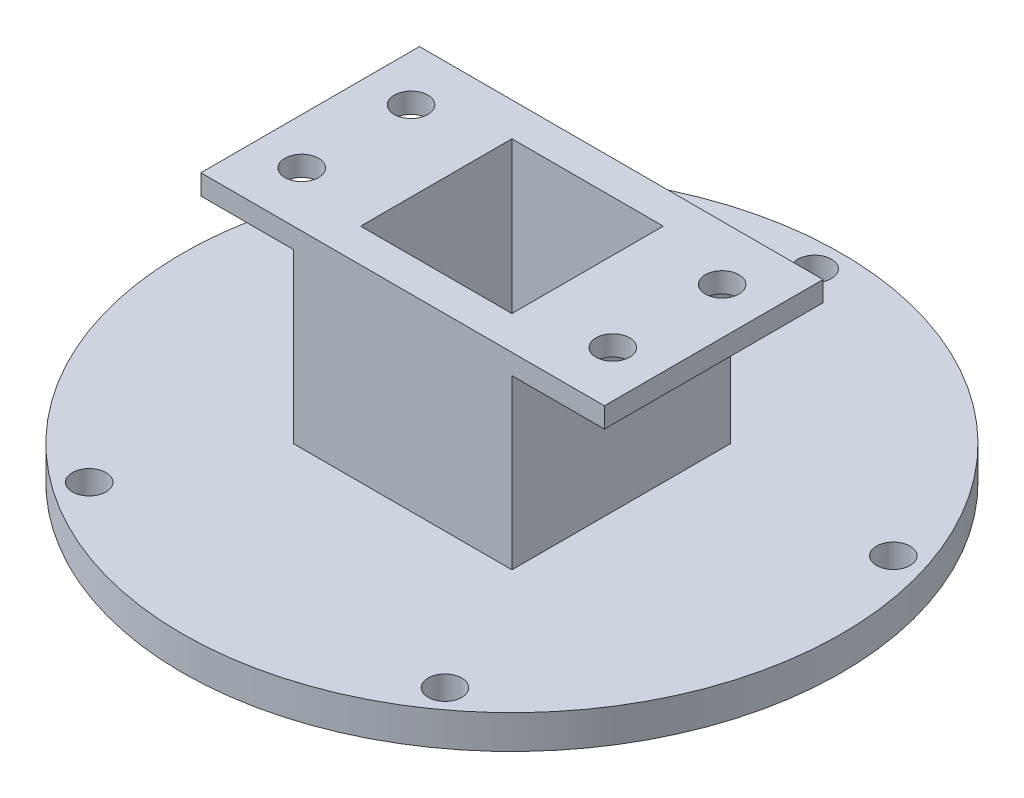
ISO-10303-21;
HEADER;
FILE_DESCRIPTION(('STEP AP214'),'2;1');
FILE_NAME('part.step','',(''),(''),'','','');
FILE_SCHEMA(('AUTOMOTIVE_DESIGN { 1 0 10303 214 1 1 1 1 }'));
ENDSEC;
DATA;
#1=APPLICATION_CONTEXT('core data for automotive mechanical design processes');
#2=APPLICATION_PROTOCOL_DEFINITION('international standard','automotive_design',2000,#1);
#3=PRODUCT_CONTEXT('',#1,'mechanical');
#4=PRODUCT('Part','Part','',(#3));
#5=PRODUCT_RELATED_PRODUCT_CATEGORY('part','',(#4));
#6=PRODUCT_DEFINITION_FORMATION('','',#4);
#7=PRODUCT_DEFINITION_CONTEXT('part definition',#1,'design');
#8=PRODUCT_DEFINITION('design','',#6,#7);
#9=PRODUCT_DEFINITION_SHAPE('','',#8);
#10=(LENGTH_UNIT() NAMED_UNIT(*) SI_UNIT(.MILLI.,.METRE.));
#11=(NAMED_UNIT(*) PLANE_ANGLE_UNIT() SI_UNIT($,.RADIAN.));
#12=(NAMED_UNIT(*) SI_UNIT($,.STERADIAN.) SOLID_ANGLE_UNIT());
#13=UNCERTAINTY_MEASURE_WITH_UNIT(LENGTH_MEASURE(1.E-05),#10,'distance_accuracy_value','');
#14=(GEOMETRIC_REPRESENTATION_CONTEXT(3) GLOBAL_UNCERTAINTY_ASSIGNED_CONTEXT((#13)) GLOBAL_UNIT_ASSIGNED_CONTEXT((#10,
#11,#12)) REPRESENTATION_CONTEXT('',''));
#15=CARTESIAN_POINT('',(0.,0.,0.));
#16=DIRECTION('',(0.,0.,1.));
#17=DIRECTION('',(1.,0.,0.));
#18=AXIS2_PLACEMENT_3D('',#15,#16,#17);
#19=CARTESIAN_POINT('',(0.,10.,0.));
#20=DIRECTION('',(0.,1.,0.));
#21=DIRECTION('',(0.,0.,1.));
#22=AXIS2_PLACEMENT_3D('',#19,#20,#21);
#23=PLANE('',#22);
#24=CARTESIAN_POINT('',(-52.9006727063157,10.,72.8115294937475));
#25=DIRECTION('',(0.,1.,0.));
#26=DIRECTION('',(0.,0.,1.));
#27=AXIS2_PLACEMENT_3D('',#24,#25,#26);
#28=CIRCLE('',#27,5.00000000000802);
#29=CARTESIAN_POINT('',(-52.9006727063157,10.,77.8115294937556));
#30=VERTEX_POINT('',#29);
#31=EDGE_CURVE('E304',#30,#30,#28,.T.);
#32=ORIENTED_EDGE('',*,*,#31,.F.);
#33=EDGE_LOOP('',(#32));
#34=FACE_BOUND('',#33,.T.);
#35=CARTESIAN_POINT('',(85.5950864665665,10.,-27.8115294937489));
#36=DIRECTION('',(0.,1.,0.));
#37=DIRECTION('',(0.,0.,1.));
#38=AXIS2_PLACEMENT_3D('',#35,#36,#37);
#39=CIRCLE('',#38,5.00000000000173);
#40=CARTESIAN_POINT('',(85.5950864665665,10.,-22.8115294937472));
#41=VERTEX_POINT('',#40);
#42=EDGE_CURVE('E320',#41,#41,#39,.T.);
#43=ORIENTED_EDGE('',*,*,#42,.F.);
#44=EDGE_LOOP('',(#43));
#45=FACE_BOUND('',#44,.T.);
#46=CARTESIAN_POINT('',(0.,10.,0.));
#47=DIRECTION('',(0.,1.,0.));
#48=DIRECTION('',(0.,0.,1.));
#49=AXIS2_PLACEMENT_3D('',#46,#47,#48);
#50=CIRCLE('',#49,98.);
#51=CARTESIAN_POINT('',(0.,10.,98.));
#52=VERTEX_POINT('',#51);
#53=EDGE_CURVE('E11',#52,#52,#50,.T.);
#54=ORIENTED_EDGE('',*,*,#53,.T.);
#55=EDGE_LOOP('',(#54));
#56=FACE_BOUND('',#55,.T.);
#57=CARTESIAN_POINT('',(0.,10.,-90.));
#58=DIRECTION('',(0.,1.,0.));
#59=DIRECTION('',(0.,0.,1.));
#60=AXIS2_PLACEMENT_3D('',#57,#58,#59);
#61=CIRCLE('',#60,5.);
#62=CARTESIAN_POINT('',(0.,10.,-85.));
#63=VERTEX_POINT('',#62);
#64=EDGE_CURVE('E328',#63,#63,#61,.T.);
#65=ORIENTED_EDGE('',*,*,#64,.F.);
#66=EDGE_LOOP('',(#65));
#67=FACE_BOUND('',#66,.T.);
#68=CARTESIAN_POINT('',(52.9006727063295,10.,72.811529493743));
#69=DIRECTION('',(0.,1.,0.));
#70=DIRECTION('',(0.,0.,1.));
#71=AXIS2_PLACEMENT_3D('',#68,#69,#70);
#72=CIRCLE('',#71,5.00000000000648);
#73=CARTESIAN_POINT('',(52.9006727063295,10.,77.8115294937495));
#74=VERTEX_POINT('',#73);
#75=EDGE_CURVE('E312',#74,#74,#72,.T.);
#76=ORIENTED_EDGE('',*,*,#75,.F.);
#77=EDGE_LOOP('',(#76));
#78=FACE_BOUND('',#77,.T.);
#79=CARTESIAN_POINT('',(-85.5950864665612,10.,-27.8115294937416));
#80=DIRECTION('',(0.,1.,0.));
#81=DIRECTION('',(0.,0.,1.));
#82=AXIS2_PLACEMENT_3D('',#79,#80,#81);
#83=CIRCLE('',#82,5.00000000000458);
#84=CARTESIAN_POINT('',(-85.5950864665612,10.,-22.811529493737));
#85=VERTEX_POINT('',#84);
#86=EDGE_CURVE('E296',#85,#85,#83,.T.);
#87=ORIENTED_EDGE('',*,*,#86,.F.);
#88=EDGE_LOOP('',(#87));
#89=FACE_BOUND('',#88,.T.);
#90=DIRECTION('',(-1.,0.,0.));
#91=VECTOR('',#90,1.);
#92=CARTESIAN_POINT('',(-32.5,10.,-32.5));
#93=LINE('',#92,#91);
#94=CARTESIAN_POINT('',(32.5,10.,-32.5));
#95=VERTEX_POINT('',#94);
#96=CARTESIAN_POINT('',(-32.5,10.,-32.5));
#97=VERTEX_POINT('',#96);
#98=EDGE_CURVE('E273',#95,#97,#93,.T.);
#99=ORIENTED_EDGE('',*,*,#98,.F.);
#100=DIRECTION('',(0.,0.,-1.));
#101=VECTOR('',#100,1.);
#102=CARTESIAN_POINT('',(32.5,10.,-32.5));
#103=LINE('',#102,#101);
#104=CARTESIAN_POINT('',(32.5,10.,32.5));
#105=VERTEX_POINT('',#104);
#106=EDGE_CURVE('E259',#105,#95,#103,.T.);
#107=ORIENTED_EDGE('',*,*,#106,.F.);
#108=DIRECTION('',(1.,0.,0.));
#109=VECTOR('',#108,1.);
#110=CARTESIAN_POINT('',(-32.5,10.,32.5));
#111=LINE('',#110,#109);
#112=CARTESIAN_POINT('',(-32.5,10.,32.5));
#113=VERTEX_POINT('',#112);
#114=EDGE_CURVE('E265',#113,#105,#111,.T.);
#115=ORIENTED_EDGE('',*,*,#114,.F.);
#116=DIRECTION('',(0.,0.,1.));
#117=VECTOR('',#116,1.);
#118=CARTESIAN_POINT('',(-32.5,10.,-32.5));
#119=LINE('',#118,#117);
#120=EDGE_CURVE('E276',#97,#113,#119,.T.);
#121=ORIENTED_EDGE('',*,*,#120,.F.);
#122=EDGE_LOOP('',(#99,#107,#115,#121));
#123=FACE_BOUND('',#122,.T.);
#124=ADVANCED_FACE('F43',(#34,#45,#56,#67,#78,#89,#123),#23,.T.);
#125=CARTESIAN_POINT('',(0.,0.,0.));
#126=DIRECTION('',(0.,1.,0.));
#127=DIRECTION('',(0.,0.,1.));
#128=AXIS2_PLACEMENT_3D('',#125,#126,#127);
#129=PLANE('',#128);
#130=DIRECTION('',(1.,0.,0.));
#131=VECTOR('',#130,1.);
#132=CARTESIAN_POINT('',(-22.5,0.,22.5));
#133=LINE('',#132,#131);
#134=CARTESIAN_POINT('',(-22.5,0.,22.5));
#135=VERTEX_POINT('',#134);
#136=CARTESIAN_POINT('',(22.5,0.,22.5));
#137=VERTEX_POINT('',#136);
#138=EDGE_CURVE('E142',#135,#137,#133,.T.);
#139=ORIENTED_EDGE('',*,*,#138,.T.);
#140=DIRECTION('',(0.,0.,-1.));
#141=VECTOR('',#140,1.);
#142=CARTESIAN_POINT('',(22.5,0.,-22.5));
#143=LINE('',#142,#141);
#144=CARTESIAN_POINT('',(22.5,0.,-22.5));
#145=VERTEX_POINT('',#144);
#146=EDGE_CURVE('E135',#137,#145,#143,.T.);
#147=ORIENTED_EDGE('',*,*,#146,.T.);
#148=DIRECTION('',(-1.,0.,0.));
#149=VECTOR('',#148,1.);
#150=CARTESIAN_POINT('',(-22.5,0.,-22.5));
#151=LINE('',#150,#149);
#152=CARTESIAN_POINT('',(-22.5,0.,-22.5));
#153=VERTEX_POINT('',#152);
#154=EDGE_CURVE('E145',#145,#153,#151,.T.);
#155=ORIENTED_EDGE('',*,*,#154,.T.);
#156=DIRECTION('',(0.,0.,1.));
#157=VECTOR('',#156,1.);
#158=CARTESIAN_POINT('',(-22.5,0.,-22.5));
#159=LINE('',#158,#157);
#160=EDGE_CURVE('E59',#153,#135,#159,.T.);
#161=ORIENTED_EDGE('',*,*,#160,.T.);
#162=EDGE_LOOP('',(#139,#147,#155,#161));
#163=FACE_BOUND('',#162,.T.);
#164=CARTESIAN_POINT('',(0.,0.,0.));
#165=DIRECTION('',(0.,1.,0.));
#166=DIRECTION('',(0.,0.,1.));
#167=AXIS2_PLACEMENT_3D('',#164,#165,#166);
#168=CIRCLE('',#167,98.);
#169=CARTESIAN_POINT('',(0.,0.,98.));
#170=VERTEX_POINT('',#169);
#171=EDGE_CURVE('E47',#170,#170,#168,.T.);
#172=ORIENTED_EDGE('',*,*,#171,.F.);
#173=EDGE_LOOP('',(#172));
#174=FACE_BOUND('',#173,.T.);
#175=CARTESIAN_POINT('',(0.,0.,-90.));
#176=DIRECTION('',(0.,1.,0.));
#177=DIRECTION('',(0.,0.,1.));
#178=AXIS2_PLACEMENT_3D('',#175,#176,#177);
#179=CIRCLE('',#178,5.);
#180=CARTESIAN_POINT('',(0.,0.,-85.));
#181=VERTEX_POINT('',#180);
#182=EDGE_CURVE('E324',#181,#181,#179,.T.);
#183=ORIENTED_EDGE('',*,*,#182,.T.);
#184=EDGE_LOOP('',(#183));
#185=FACE_BOUND('',#184,.T.);
#186=CARTESIAN_POINT('',(85.5950864665665,0.,-27.8115294937489));
#187=DIRECTION('',(0.,1.,0.));
#188=DIRECTION('',(0.,0.,1.));
#189=AXIS2_PLACEMENT_3D('',#186,#187,#188);
#190=CIRCLE('',#189,5.00000000000173);
#191=CARTESIAN_POINT('',(85.5950864665665,0.,-22.8115294937472));
#192=VERTEX_POINT('',#191);
#193=EDGE_CURVE('E316',#192,#192,#190,.T.);
#194=ORIENTED_EDGE('',*,*,#193,.T.);
#195=EDGE_LOOP('',(#194));
#196=FACE_BOUND('',#195,.T.);
#197=CARTESIAN_POINT('',(52.9006727063295,0.,72.811529493743));
#198=DIRECTION('',(0.,1.,0.));
#199=DIRECTION('',(0.,0.,1.));
#200=AXIS2_PLACEMENT_3D('',#197,#198,#199);
#201=CIRCLE('',#200,5.00000000000648);
#202=CARTESIAN_POINT('',(52.9006727063295,0.,77.8115294937495));
#203=VERTEX_POINT('',#202);
#204=EDGE_CURVE('E308',#203,#203,#201,.T.);
#205=ORIENTED_EDGE('',*,*,#204,.T.);
#206=EDGE_LOOP('',(#205));
#207=FACE_BOUND('',#206,.T.);
#208=CARTESIAN_POINT('',(-52.9006727063157,0.,72.8115294937475));
#209=DIRECTION('',(0.,1.,0.));
#210=DIRECTION('',(0.,0.,1.));
#211=AXIS2_PLACEMENT_3D('',#208,#209,#210);
#212=CIRCLE('',#211,5.00000000000802);
#213=CARTESIAN_POINT('',(-52.9006727063157,0.,77.8115294937556));
#214=VERTEX_POINT('',#213);
#215=EDGE_CURVE('E300',#214,#214,#212,.T.);
#216=ORIENTED_EDGE('',*,*,#215,.T.);
#217=EDGE_LOOP('',(#216));
#218=FACE_BOUND('',#217,.T.);
#219=CARTESIAN_POINT('',(-85.5950864665612,0.,-27.8115294937416));
#220=DIRECTION('',(0.,1.,0.));
#221=DIRECTION('',(0.,0.,1.));
#222=AXIS2_PLACEMENT_3D('',#219,#220,#221);
#223=CIRCLE('',#222,5.00000000000458);
#224=CARTESIAN_POINT('',(-85.5950864665612,0.,-22.811529493737));
#225=VERTEX_POINT('',#224);
#226=EDGE_CURVE('E295',#225,#225,#223,.T.);
#227=ORIENTED_EDGE('',*,*,#226,.T.);
#228=EDGE_LOOP('',(#227));
#229=FACE_BOUND('',#228,.T.);
#230=ADVANCED_FACE('F150',(#163,#174,#185,#196,#207,#218,#229),#129,.F.);
#231=CARTESIAN_POINT('',(0.,10.,0.));
#232=DIRECTION('',(0.,-1.,0.));
#233=DIRECTION('',(0.,0.,-1.));
#234=AXIS2_PLACEMENT_3D('',#231,#232,#233);
#235=CYLINDRICAL_SURFACE('',#234,98.);
#236=ORIENTED_EDGE('',*,*,#53,.F.);
#237=EDGE_LOOP('',(#236));
#238=FACE_BOUND('',#237,.T.);
#239=ORIENTED_EDGE('',*,*,#171,.T.);
#240=EDGE_LOOP('',(#239));
#241=FACE_BOUND('',#240,.T.);
#242=ADVANCED_FACE('F45',(#238,#241),#235,.T.);
#243=CARTESIAN_POINT('',(0.,10.,-90.));
#244=DIRECTION('',(0.,-1.,0.));
#245=DIRECTION('',(0.,0.,-1.));
#246=AXIS2_PLACEMENT_3D('',#243,#244,#245);
#247=CYLINDRICAL_SURFACE('',#246,5.);
#248=ORIENTED_EDGE('',*,*,#64,.T.);
#249=EDGE_LOOP('',(#248));
#250=FACE_BOUND('',#249,.T.);
#251=ORIENTED_EDGE('',*,*,#182,.F.);
#252=EDGE_LOOP('',(#251));
#253=FACE_BOUND('',#252,.T.);
#254=ADVANCED_FACE('F338',(#250,#253),#247,.F.);
#255=CARTESIAN_POINT('',(85.5950864665665,10.,-27.8115294937489));
#256=DIRECTION('',(0.,-1.,0.));
#257=DIRECTION('',(0.,0.,-1.));
#258=AXIS2_PLACEMENT_3D('',#255,#256,#257);
#259=CYLINDRICAL_SURFACE('',#258,5.00000000000173);
#260=ORIENTED_EDGE('',*,*,#42,.T.);
#261=EDGE_LOOP('',(#260));
#262=FACE_BOUND('',#261,.T.);
#263=ORIENTED_EDGE('',*,*,#193,.F.);
#264=EDGE_LOOP('',(#263));
#265=FACE_BOUND('',#264,.T.);
#266=ADVANCED_FACE('F340',(#262,#265),#259,.F.);
#267=CARTESIAN_POINT('',(52.9006727063295,10.,72.811529493743));
#268=DIRECTION('',(0.,-1.,0.));
#269=DIRECTION('',(0.,0.,-1.));
#270=AXIS2_PLACEMENT_3D('',#267,#268,#269);
#271=CYLINDRICAL_SURFACE('',#270,5.00000000000648);
#272=ORIENTED_EDGE('',*,*,#75,.T.);
#273=EDGE_LOOP('',(#272));
#274=FACE_BOUND('',#273,.T.);
#275=ORIENTED_EDGE('',*,*,#204,.F.);
#276=EDGE_LOOP('',(#275));
#277=FACE_BOUND('',#276,.T.);
#278=ADVANCED_FACE('F347',(#274,#277),#271,.F.);
#279=CARTESIAN_POINT('',(-52.9006727063157,10.,72.8115294937475));
#280=DIRECTION('',(0.,-1.,0.));
#281=DIRECTION('',(0.,0.,-1.));
#282=AXIS2_PLACEMENT_3D('',#279,#280,#281);
#283=CYLINDRICAL_SURFACE('',#282,5.00000000000802);
#284=ORIENTED_EDGE('',*,*,#31,.T.);
#285=EDGE_LOOP('',(#284));
#286=FACE_BOUND('',#285,.T.);
#287=ORIENTED_EDGE('',*,*,#215,.F.);
#288=EDGE_LOOP('',(#287));
#289=FACE_BOUND('',#288,.T.);
#290=ADVANCED_FACE('F433',(#286,#289),#283,.F.);
#291=CARTESIAN_POINT('',(-85.5950864665612,10.,-27.8115294937416));
#292=DIRECTION('',(0.,-1.,0.));
#293=DIRECTION('',(0.,0.,-1.));
#294=AXIS2_PLACEMENT_3D('',#291,#292,#293);
#295=CYLINDRICAL_SURFACE('',#294,5.00000000000458);
#296=ORIENTED_EDGE('',*,*,#86,.T.);
#297=EDGE_LOOP('',(#296));
#298=FACE_BOUND('',#297,.T.);
#299=ORIENTED_EDGE('',*,*,#226,.F.);
#300=EDGE_LOOP('',(#299));
#301=FACE_BOUND('',#300,.T.);
#302=ADVANCED_FACE('F429',(#298,#301),#295,.F.);
#303=CARTESIAN_POINT('',(32.5,60.,-32.5));
#304=DIRECTION('',(-1.,0.,0.));
#305=DIRECTION('',(0.,0.,1.));
#306=AXIS2_PLACEMENT_3D('',#303,#304,#305);
#307=PLANE('',#306);
#308=ORIENTED_EDGE('',*,*,#106,.T.);
#309=DIRECTION('',(0.,-1.,0.));
#310=VECTOR('',#309,1.);
#311=CARTESIAN_POINT('',(32.5,60.,-32.5));
#312=LINE('',#311,#310);
#313=CARTESIAN_POINT('',(32.5,60.,-32.5));
#314=VERTEX_POINT('',#313);
#315=EDGE_CURVE('E292',#314,#95,#312,.T.);
#316=ORIENTED_EDGE('',*,*,#315,.F.);
#317=DIRECTION('',(0.,0.,-1.));
#318=VECTOR('',#317,1.);
#319=CARTESIAN_POINT('',(32.5,60.,-32.5));
#320=LINE('',#319,#318);
#321=CARTESIAN_POINT('',(32.5,60.,32.5));
#322=VERTEX_POINT('',#321);
#323=EDGE_CURVE('E260',#322,#314,#320,.T.);
#324=ORIENTED_EDGE('',*,*,#323,.F.);
#325=DIRECTION('',(0.,-1.,0.));
#326=VECTOR('',#325,1.);
#327=CARTESIAN_POINT('',(32.5,60.,32.5));
#328=LINE('',#327,#326);
#329=EDGE_CURVE('E269',#322,#105,#328,.T.);
#330=ORIENTED_EDGE('',*,*,#329,.T.);
#331=EDGE_LOOP('',(#308,#316,#324,#330));
#332=FACE_BOUND('',#331,.T.);
#333=ADVANCED_FACE('F426',(#332),#307,.F.);
#334=CARTESIAN_POINT('',(-32.5,60.,-32.5));
#335=DIRECTION('',(0.,0.,1.));
#336=DIRECTION('',(1.,0.,0.));
#337=AXIS2_PLACEMENT_3D('',#334,#335,#336);
#338=PLANE('',#337);
#339=ORIENTED_EDGE('',*,*,#98,.T.);
#340=DIRECTION('',(0.,-1.,0.));
#341=VECTOR('',#340,1.);
#342=CARTESIAN_POINT('',(-32.5,60.,-32.5));
#343=LINE('',#342,#341);
#344=CARTESIAN_POINT('',(-32.5,60.,-32.5));
#345=VERTEX_POINT('',#344);
#346=EDGE_CURVE('E288',#345,#97,#343,.T.);
#347=ORIENTED_EDGE('',*,*,#346,.F.);
#348=DIRECTION('',(-1.,0.,0.));
#349=VECTOR('',#348,1.);
#350=CARTESIAN_POINT('',(-60.,60.,-32.5));
#351=LINE('',#350,#349);
#352=CARTESIAN_POINT('',(-60.,60.,-32.5));
#353=VERTEX_POINT('',#352);
#354=EDGE_CURVE('E232',#345,#353,#351,.T.);
#355=ORIENTED_EDGE('',*,*,#354,.T.);
#356=DIRECTION('',(0.,-1.,0.));
#357=VECTOR('',#356,1.);
#358=CARTESIAN_POINT('',(-60.,66.,-32.5));
#359=LINE('',#358,#357);
#360=CARTESIAN_POINT('',(-60.,66.,-32.5));
#361=VERTEX_POINT('',#360);
#362=EDGE_CURVE('E251',#361,#353,#359,.T.);
#363=ORIENTED_EDGE('',*,*,#362,.F.);
#364=DIRECTION('',(-1.,0.,0.));
#365=VECTOR('',#364,1.);
#366=CARTESIAN_POINT('',(-60.,66.,-32.5));
#367=LINE('',#366,#365);
#368=CARTESIAN_POINT('',(60.,66.,-32.5));
#369=VERTEX_POINT('',#368);
#370=EDGE_CURVE('E218',#369,#361,#367,.T.);
#371=ORIENTED_EDGE('',*,*,#370,.F.);
#372=DIRECTION('',(0.,-1.,0.));
#373=VECTOR('',#372,1.);
#374=CARTESIAN_POINT('',(60.,66.,-32.5));
#375=LINE('',#374,#373);
#376=CARTESIAN_POINT('',(60.,60.,-32.5));
#377=VERTEX_POINT('',#376);
#378=EDGE_CURVE('E255',#369,#377,#375,.T.);
#379=ORIENTED_EDGE('',*,*,#378,.T.);
#380=EDGE_CURVE('E233',#377,#314,#351,.T.);
#381=ORIENTED_EDGE('',*,*,#380,.T.);
#382=ORIENTED_EDGE('',*,*,#315,.T.);
#383=EDGE_LOOP('',(#339,#347,#355,#363,#371,#379,#381,#382));
#384=FACE_BOUND('',#383,.T.);
#385=ADVANCED_FACE('F374',(#384),#338,.F.);
#386=CARTESIAN_POINT('',(-32.5,60.,-32.5));
#387=DIRECTION('',(1.,0.,0.));
#388=DIRECTION('',(0.,0.,-1.));
#389=AXIS2_PLACEMENT_3D('',#386,#387,#388);
#390=PLANE('',#389);
#391=ORIENTED_EDGE('',*,*,#120,.T.);
#392=DIRECTION('',(0.,-1.,0.));
#393=VECTOR('',#392,1.);
#394=CARTESIAN_POINT('',(-32.5,60.,32.5));
#395=LINE('',#394,#393);
#396=CARTESIAN_POINT('',(-32.5,60.,32.5));
#397=VERTEX_POINT('',#396);
#398=EDGE_CURVE('E285',#397,#113,#395,.T.);
#399=ORIENTED_EDGE('',*,*,#398,.F.);
#400=DIRECTION('',(0.,0.,1.));
#401=VECTOR('',#400,1.);
#402=CARTESIAN_POINT('',(-32.5,60.,-32.5));
#403=LINE('',#402,#401);
#404=EDGE_CURVE('E264',#345,#397,#403,.T.);
#405=ORIENTED_EDGE('',*,*,#404,.F.);
#406=ORIENTED_EDGE('',*,*,#346,.T.);
#407=EDGE_LOOP('',(#391,#399,#405,#406));
#408=FACE_BOUND('',#407,.T.);
#409=ADVANCED_FACE('F377',(#408),#390,.F.);
#410=CARTESIAN_POINT('',(-32.5,60.,32.5));
#411=DIRECTION('',(0.,0.,-1.));
#412=DIRECTION('',(-1.,0.,0.));
#413=AXIS2_PLACEMENT_3D('',#410,#411,#412);
#414=PLANE('',#413);
#415=ORIENTED_EDGE('',*,*,#114,.T.);
#416=ORIENTED_EDGE('',*,*,#329,.F.);
#417=DIRECTION('',(1.,0.,0.));
#418=VECTOR('',#417,1.);
#419=CARTESIAN_POINT('',(-60.,60.,32.5));
#420=LINE('',#419,#418);
#421=CARTESIAN_POINT('',(60.,60.,32.5));
#422=VERTEX_POINT('',#421);
#423=EDGE_CURVE('E240',#322,#422,#420,.T.);
#424=ORIENTED_EDGE('',*,*,#423,.T.);
#425=DIRECTION('',(0.,-1.,0.));
#426=VECTOR('',#425,1.);
#427=CARTESIAN_POINT('',(60.,66.,32.5));
#428=LINE('',#427,#426);
#429=CARTESIAN_POINT('',(60.,66.,32.5));
#430=VERTEX_POINT('',#429);
#431=EDGE_CURVE('E228',#430,#422,#428,.T.);
#432=ORIENTED_EDGE('',*,*,#431,.F.);
#433=DIRECTION('',(1.,0.,0.));
#434=VECTOR('',#433,1.);
#435=CARTESIAN_POINT('',(-60.,66.,32.5));
#436=LINE('',#435,#434);
#437=CARTESIAN_POINT('',(-60.,66.,32.5));
#438=VERTEX_POINT('',#437);
#439=EDGE_CURVE('E225',#438,#430,#436,.T.);
#440=ORIENTED_EDGE('',*,*,#439,.F.);
#441=DIRECTION('',(0.,-1.,0.));
#442=VECTOR('',#441,1.);
#443=CARTESIAN_POINT('',(-60.,66.,32.5));
#444=LINE('',#443,#442);
#445=CARTESIAN_POINT('',(-60.,60.,32.5));
#446=VERTEX_POINT('',#445);
#447=EDGE_CURVE('E247',#438,#446,#444,.T.);
#448=ORIENTED_EDGE('',*,*,#447,.T.);
#449=EDGE_CURVE('E219',#446,#397,#420,.T.);
#450=ORIENTED_EDGE('',*,*,#449,.T.);
#451=ORIENTED_EDGE('',*,*,#398,.T.);
#452=EDGE_LOOP('',(#415,#416,#424,#432,#440,#448,#450,#451));
#453=FACE_BOUND('',#452,.T.);
#454=ADVANCED_FACE('F389',(#453),#414,.F.);
#455=CARTESIAN_POINT('',(0.,60.,0.));
#456=DIRECTION('',(0.,1.,0.));
#457=DIRECTION('',(0.,0.,1.));
#458=AXIS2_PLACEMENT_3D('',#455,#456,#457);
#459=PLANE('',#458);
#460=CARTESIAN_POINT('',(46.25,60.,-16.2500000000001));
#461=DIRECTION('',(0.,1.,0.));
#462=DIRECTION('',(0.,0.,-1.));
#463=AXIS2_PLACEMENT_3D('',#460,#461,#462);
#464=CIRCLE('',#463,5.);
#465=CARTESIAN_POINT('',(46.25,60.,-21.2500000000001));
#466=VERTEX_POINT('',#465);
#467=EDGE_CURVE('E194',#466,#466,#464,.T.);
#468=ORIENTED_EDGE('',*,*,#467,.T.);
#469=EDGE_LOOP('',(#468));
#470=FACE_BOUND('',#469,.T.);
#471=CARTESIAN_POINT('',(46.25,60.,16.2500000000001));
#472=DIRECTION('',(0.,1.,0.));
#473=DIRECTION('',(0.,0.,1.));
#474=AXIS2_PLACEMENT_3D('',#471,#472,#473);
#475=CIRCLE('',#474,4.99999999999999);
#476=CARTESIAN_POINT('',(46.25,60.,21.2500000000001));
#477=VERTEX_POINT('',#476);
#478=EDGE_CURVE('E186',#477,#477,#475,.T.);
#479=ORIENTED_EDGE('',*,*,#478,.T.);
#480=EDGE_LOOP('',(#479));
#481=FACE_BOUND('',#480,.T.);
#482=ORIENTED_EDGE('',*,*,#423,.F.);
#483=ORIENTED_EDGE('',*,*,#323,.T.);
#484=ORIENTED_EDGE('',*,*,#380,.F.);
#485=DIRECTION('',(0.,0.,-1.));
#486=VECTOR('',#485,1.);
#487=CARTESIAN_POINT('',(60.,60.,-32.5));
#488=LINE('',#487,#486);
#489=EDGE_CURVE('E210',#422,#377,#488,.T.);
#490=ORIENTED_EDGE('',*,*,#489,.F.);
#491=EDGE_LOOP('',(#482,#483,#484,#490));
#492=FACE_BOUND('',#491,.T.);
#493=ADVANCED_FACE('F398',(#470,#481,#492),#459,.F.);
#494=CARTESIAN_POINT('',(-46.25,60.,16.25));
#495=DIRECTION('',(0.,1.,0.));
#496=DIRECTION('',(0.,0.,-1.));
#497=AXIS2_PLACEMENT_3D('',#494,#495,#496);
#498=CIRCLE('',#497,5.);
#499=CARTESIAN_POINT('',(-46.25,60.,11.25));
#500=VERTEX_POINT('',#499);
#501=EDGE_CURVE('E176',#500,#500,#498,.T.);
#502=ORIENTED_EDGE('',*,*,#501,.T.);
#503=EDGE_LOOP('',(#502));
#504=FACE_BOUND('',#503,.T.);
#505=CARTESIAN_POINT('',(-46.25,60.,-16.25));
#506=DIRECTION('',(0.,1.,0.));
#507=DIRECTION('',(0.,0.,1.));
#508=AXIS2_PLACEMENT_3D('',#505,#506,#507);
#509=CIRCLE('',#508,5.);
#510=CARTESIAN_POINT('',(-46.25,60.,-11.25));
#511=VERTEX_POINT('',#510);
#512=EDGE_CURVE('E202',#511,#511,#509,.T.);
#513=ORIENTED_EDGE('',*,*,#512,.T.);
#514=EDGE_LOOP('',(#513));
#515=FACE_BOUND('',#514,.T.);
#516=ORIENTED_EDGE('',*,*,#354,.F.);
#517=ORIENTED_EDGE('',*,*,#404,.T.);
#518=ORIENTED_EDGE('',*,*,#449,.F.);
#519=DIRECTION('',(0.,0.,1.));
#520=VECTOR('',#519,1.);
#521=CARTESIAN_POINT('',(-60.,60.,-32.5));
#522=LINE('',#521,#520);
#523=EDGE_CURVE('E237',#353,#446,#522,.T.);
#524=ORIENTED_EDGE('',*,*,#523,.F.);
#525=EDGE_LOOP('',(#516,#517,#518,#524));
#526=FACE_BOUND('',#525,.T.);
#527=ADVANCED_FACE('F382',(#504,#515,#526),#459,.F.);
#528=CARTESIAN_POINT('',(0.,66.,0.));
#529=DIRECTION('',(0.,1.,0.));
#530=DIRECTION('',(0.,0.,1.));
#531=AXIS2_PLACEMENT_3D('',#528,#529,#530);
#532=PLANE('',#531);
#533=DIRECTION('',(0.,0.,-1.));
#534=VECTOR('',#533,1.);
#535=CARTESIAN_POINT('',(22.5,66.,-22.5));
#536=LINE('',#535,#534);
#537=CARTESIAN_POINT('',(22.5,66.,22.5));
#538=VERTEX_POINT('',#537);
#539=CARTESIAN_POINT('',(22.5,66.,-22.5));
#540=VERTEX_POINT('',#539);
#541=EDGE_CURVE('E67',#538,#540,#536,.T.);
#542=ORIENTED_EDGE('',*,*,#541,.F.);
#543=DIRECTION('',(1.,0.,0.));
#544=VECTOR('',#543,1.);
#545=CARTESIAN_POINT('',(-22.5,66.,22.5));
#546=LINE('',#545,#544);
#547=CARTESIAN_POINT('',(-22.5,66.,22.5));
#548=VERTEX_POINT('',#547);
#549=EDGE_CURVE('E154',#548,#538,#546,.T.);
#550=ORIENTED_EDGE('',*,*,#549,.F.);
#551=DIRECTION('',(0.,0.,1.));
#552=VECTOR('',#551,1.);
#553=CARTESIAN_POINT('',(-22.5,66.,-22.5));
#554=LINE('',#553,#552);
#555=CARTESIAN_POINT('',(-22.5,66.,-22.5));
#556=VERTEX_POINT('',#555);
#557=EDGE_CURVE('E158',#556,#548,#554,.T.);
#558=ORIENTED_EDGE('',*,*,#557,.F.);
#559=DIRECTION('',(-1.,0.,0.));
#560=VECTOR('',#559,1.);
#561=CARTESIAN_POINT('',(-22.5,66.,-22.5));
#562=LINE('',#561,#560);
#563=EDGE_CURVE('E167',#540,#556,#562,.T.);
#564=ORIENTED_EDGE('',*,*,#563,.F.);
#565=EDGE_LOOP('',(#542,#550,#558,#564));
#566=FACE_BOUND('',#565,.T.);
#567=CARTESIAN_POINT('',(46.25,66.,16.2500000000001));
#568=DIRECTION('',(0.,1.,0.));
#569=DIRECTION('',(0.,0.,1.));
#570=AXIS2_PLACEMENT_3D('',#567,#568,#569);
#571=CIRCLE('',#570,4.99999999999999);
#572=CARTESIAN_POINT('',(46.25,66.,21.2500000000001));
#573=VERTEX_POINT('',#572);
#574=EDGE_CURVE('E190',#573,#573,#571,.T.);
#575=ORIENTED_EDGE('',*,*,#574,.F.);
#576=EDGE_LOOP('',(#575));
#577=FACE_BOUND('',#576,.T.);
#578=CARTESIAN_POINT('',(-46.25,66.,-16.25));
#579=DIRECTION('',(0.,1.,0.));
#580=DIRECTION('',(0.,0.,1.));
#581=AXIS2_PLACEMENT_3D('',#578,#579,#580);
#582=CIRCLE('',#581,5.);
#583=CARTESIAN_POINT('',(-46.25,66.,-11.25));
#584=VERTEX_POINT('',#583);
#585=EDGE_CURVE('E206',#584,#584,#582,.T.);
#586=ORIENTED_EDGE('',*,*,#585,.F.);
#587=EDGE_LOOP('',(#586));
#588=FACE_BOUND('',#587,.T.);
#589=DIRECTION('',(0.,0.,-1.));
#590=VECTOR('',#589,1.);
#591=CARTESIAN_POINT('',(60.,66.,-32.5));
#592=LINE('',#591,#590);
#593=EDGE_CURVE('E214',#430,#369,#592,.T.);
#594=ORIENTED_EDGE('',*,*,#593,.T.);
#595=ORIENTED_EDGE('',*,*,#370,.T.);
#596=DIRECTION('',(0.,0.,1.));
#597=VECTOR('',#596,1.);
#598=CARTESIAN_POINT('',(-60.,66.,-32.5));
#599=LINE('',#598,#597);
#600=EDGE_CURVE('E222',#361,#438,#599,.T.);
#601=ORIENTED_EDGE('',*,*,#600,.T.);
#602=ORIENTED_EDGE('',*,*,#439,.T.);
#603=EDGE_LOOP('',(#594,#595,#601,#602));
#604=FACE_BOUND('',#603,.T.);
#605=CARTESIAN_POINT('',(46.25,66.,-16.2500000000001));
#606=DIRECTION('',(0.,1.,0.));
#607=DIRECTION('',(0.,0.,-1.));
#608=AXIS2_PLACEMENT_3D('',#605,#606,#607);
#609=CIRCLE('',#608,5.);
#610=CARTESIAN_POINT('',(46.25,66.,-21.2500000000001));
#611=VERTEX_POINT('',#610);
#612=EDGE_CURVE('E198',#611,#611,#609,.T.);
#613=ORIENTED_EDGE('',*,*,#612,.F.);
#614=EDGE_LOOP('',(#613));
#615=FACE_BOUND('',#614,.T.);
#616=CARTESIAN_POINT('',(-46.25,66.,16.25));
#617=DIRECTION('',(0.,1.,0.));
#618=DIRECTION('',(0.,0.,-1.));
#619=AXIS2_PLACEMENT_3D('',#616,#617,#618);
#620=CIRCLE('',#619,5.);
#621=CARTESIAN_POINT('',(-46.25,66.,11.25));
#622=VERTEX_POINT('',#621);
#623=EDGE_CURVE('E182',#622,#622,#620,.T.);
#624=ORIENTED_EDGE('',*,*,#623,.F.);
#625=EDGE_LOOP('',(#624));
#626=FACE_BOUND('',#625,.T.);
#627=ADVANCED_FACE('F401',(#566,#577,#588,#604,#615,#626),#532,.T.);
#628=CARTESIAN_POINT('',(60.,66.,-32.5));
#629=DIRECTION('',(-1.,0.,0.));
#630=DIRECTION('',(0.,0.,1.));
#631=AXIS2_PLACEMENT_3D('',#628,#629,#630);
#632=PLANE('',#631);
#633=ORIENTED_EDGE('',*,*,#489,.T.);
#634=ORIENTED_EDGE('',*,*,#378,.F.);
#635=ORIENTED_EDGE('',*,*,#593,.F.);
#636=ORIENTED_EDGE('',*,*,#431,.T.);
#637=EDGE_LOOP('',(#633,#634,#635,#636));
#638=FACE_BOUND('',#637,.T.);
#639=ADVANCED_FACE('F396',(#638),#632,.F.);
#640=CARTESIAN_POINT('',(-60.,66.,-32.5));
#641=DIRECTION('',(1.,0.,0.));
#642=DIRECTION('',(0.,0.,-1.));
#643=AXIS2_PLACEMENT_3D('',#640,#641,#642);
#644=PLANE('',#643);
#645=ORIENTED_EDGE('',*,*,#523,.T.);
#646=ORIENTED_EDGE('',*,*,#447,.F.);
#647=ORIENTED_EDGE('',*,*,#600,.F.);
#648=ORIENTED_EDGE('',*,*,#362,.T.);
#649=EDGE_LOOP('',(#645,#646,#647,#648));
#650=FACE_BOUND('',#649,.T.);
#651=ADVANCED_FACE('F405',(#650),#644,.F.);
#652=CARTESIAN_POINT('',(-46.25,66.,-16.25));
#653=DIRECTION('',(0.,-1.,0.));
#654=DIRECTION('',(0.,0.,-1.));
#655=AXIS2_PLACEMENT_3D('',#652,#653,#654);
#656=CYLINDRICAL_SURFACE('',#655,5.);
#657=ORIENTED_EDGE('',*,*,#585,.T.);
#658=EDGE_LOOP('',(#657));
#659=FACE_BOUND('',#658,.T.);
#660=ORIENTED_EDGE('',*,*,#512,.F.);
#661=EDGE_LOOP('',(#660));
#662=FACE_BOUND('',#661,.T.);
#663=ADVANCED_FACE('F407',(#659,#662),#656,.F.);
#664=CARTESIAN_POINT('',(46.25,66.,-16.2500000000001));
#665=DIRECTION('',(0.,-1.,0.));
#666=DIRECTION('',(0.,0.,-1.));
#667=AXIS2_PLACEMENT_3D('',#664,#665,#666);
#668=CYLINDRICAL_SURFACE('',#667,5.);
#669=ORIENTED_EDGE('',*,*,#612,.T.);
#670=EDGE_LOOP('',(#669));
#671=FACE_BOUND('',#670,.T.);
#672=ORIENTED_EDGE('',*,*,#467,.F.);
#673=EDGE_LOOP('',(#672));
#674=FACE_BOUND('',#673,.T.);
#675=ADVANCED_FACE('F413',(#671,#674),#668,.F.);
#676=CARTESIAN_POINT('',(46.25,66.,16.2500000000001));
#677=DIRECTION('',(0.,-1.,0.));
#678=DIRECTION('',(0.,0.,-1.));
#679=AXIS2_PLACEMENT_3D('',#676,#677,#678);
#680=CYLINDRICAL_SURFACE('',#679,4.99999999999999);
#681=ORIENTED_EDGE('',*,*,#574,.T.);
#682=EDGE_LOOP('',(#681));
#683=FACE_BOUND('',#682,.T.);
#684=ORIENTED_EDGE('',*,*,#478,.F.);
#685=EDGE_LOOP('',(#684));
#686=FACE_BOUND('',#685,.T.);
#687=ADVANCED_FACE('F523',(#683,#686),#680,.F.);
#688=CARTESIAN_POINT('',(-46.25,66.,16.25));
#689=DIRECTION('',(0.,-1.,0.));
#690=DIRECTION('',(0.,0.,-1.));
#691=AXIS2_PLACEMENT_3D('',#688,#689,#690);
#692=CYLINDRICAL_SURFACE('',#691,5.);
#693=ORIENTED_EDGE('',*,*,#623,.T.);
#694=EDGE_LOOP('',(#693));
#695=FACE_BOUND('',#694,.T.);
#696=ORIENTED_EDGE('',*,*,#501,.F.);
#697=EDGE_LOOP('',(#696));
#698=FACE_BOUND('',#697,.T.);
#699=ADVANCED_FACE('F534',(#695,#698),#692,.F.);
#700=CARTESIAN_POINT('',(22.5,0.,-22.5));
#701=DIRECTION('',(1.,0.,0.));
#702=DIRECTION('',(0.,0.,-1.));
#703=AXIS2_PLACEMENT_3D('',#700,#701,#702);
#704=PLANE('',#703);
#705=ORIENTED_EDGE('',*,*,#541,.T.);
#706=DIRECTION('',(0.,1.,0.));
#707=VECTOR('',#706,1.);
#708=CARTESIAN_POINT('',(22.5,0.,-22.5));
#709=LINE('',#708,#707);
#710=EDGE_CURVE('E131',#145,#540,#709,.T.);
#711=ORIENTED_EDGE('',*,*,#710,.F.);
#712=ORIENTED_EDGE('',*,*,#146,.F.);
#713=DIRECTION('',(0.,1.,0.));
#714=VECTOR('',#713,1.);
#715=CARTESIAN_POINT('',(22.5,0.,22.5));
#716=LINE('',#715,#714);
#717=EDGE_CURVE('E173',#137,#538,#716,.T.);
#718=ORIENTED_EDGE('',*,*,#717,.T.);
#719=EDGE_LOOP('',(#705,#711,#712,#718));
#720=FACE_BOUND('',#719,.T.);
#721=ADVANCED_FACE('F133',(#720),#704,.F.);
#722=CARTESIAN_POINT('',(-22.5,0.,22.5));
#723=DIRECTION('',(0.,0.,1.));
#724=DIRECTION('',(1.,0.,0.));
#725=AXIS2_PLACEMENT_3D('',#722,#723,#724);
#726=PLANE('',#725);
#727=ORIENTED_EDGE('',*,*,#549,.T.);
#728=ORIENTED_EDGE('',*,*,#717,.F.);
#729=ORIENTED_EDGE('',*,*,#138,.F.);
#730=DIRECTION('',(0.,1.,0.));
#731=VECTOR('',#730,1.);
#732=CARTESIAN_POINT('',(-22.5,0.,22.5));
#733=LINE('',#732,#731);
#734=EDGE_CURVE('E177',#135,#548,#733,.T.);
#735=ORIENTED_EDGE('',*,*,#734,.T.);
#736=EDGE_LOOP('',(#727,#728,#729,#735));
#737=FACE_BOUND('',#736,.T.);
#738=ADVANCED_FACE('F636',(#737),#726,.F.);
#739=CARTESIAN_POINT('',(-22.5,0.,-22.5));
#740=DIRECTION('',(-1.,0.,0.));
#741=DIRECTION('',(0.,0.,1.));
#742=AXIS2_PLACEMENT_3D('',#739,#740,#741);
#743=PLANE('',#742);
#744=ORIENTED_EDGE('',*,*,#557,.T.);
#745=ORIENTED_EDGE('',*,*,#734,.F.);
#746=ORIENTED_EDGE('',*,*,#160,.F.);
#747=DIRECTION('',(0.,1.,0.));
#748=VECTOR('',#747,1.);
#749=CARTESIAN_POINT('',(-22.5,0.,-22.5));
#750=LINE('',#749,#748);
#751=EDGE_CURVE('E141',#153,#556,#750,.T.);
#752=ORIENTED_EDGE('',*,*,#751,.T.);
#753=EDGE_LOOP('',(#744,#745,#746,#752));
#754=FACE_BOUND('',#753,.T.);
#755=ADVANCED_FACE('F644',(#754),#743,.F.);
#756=CARTESIAN_POINT('',(-22.5,0.,-22.5));
#757=DIRECTION('',(0.,0.,-1.));
#758=DIRECTION('',(-1.,0.,0.));
#759=AXIS2_PLACEMENT_3D('',#756,#757,#758);
#760=PLANE('',#759);
#761=ORIENTED_EDGE('',*,*,#563,.T.);
#762=ORIENTED_EDGE('',*,*,#751,.F.);
#763=ORIENTED_EDGE('',*,*,#154,.F.);
#764=ORIENTED_EDGE('',*,*,#710,.T.);
#765=EDGE_LOOP('',(#761,#762,#763,#764));
#766=FACE_BOUND('',#765,.T.);
#767=ADVANCED_FACE('F146',(#766),#760,.F.);
#768=CLOSED_SHELL('',(#124,#230,#242,#254,#266,#278,#290,#302,#333,#385,#409,#454,#493,#527,
#627,#639,#651,#663,#675,#687,#699,#721,#738,#755,#767));
#769=MANIFOLD_SOLID_BREP('B2',#768);
#770=ADVANCED_BREP_SHAPE_REPRESENTATION('',(#18,#769),#14);
#771=SHAPE_DEFINITION_REPRESENTATION(#9,#770);
ENDSEC;
END-ISO-10303-21;
